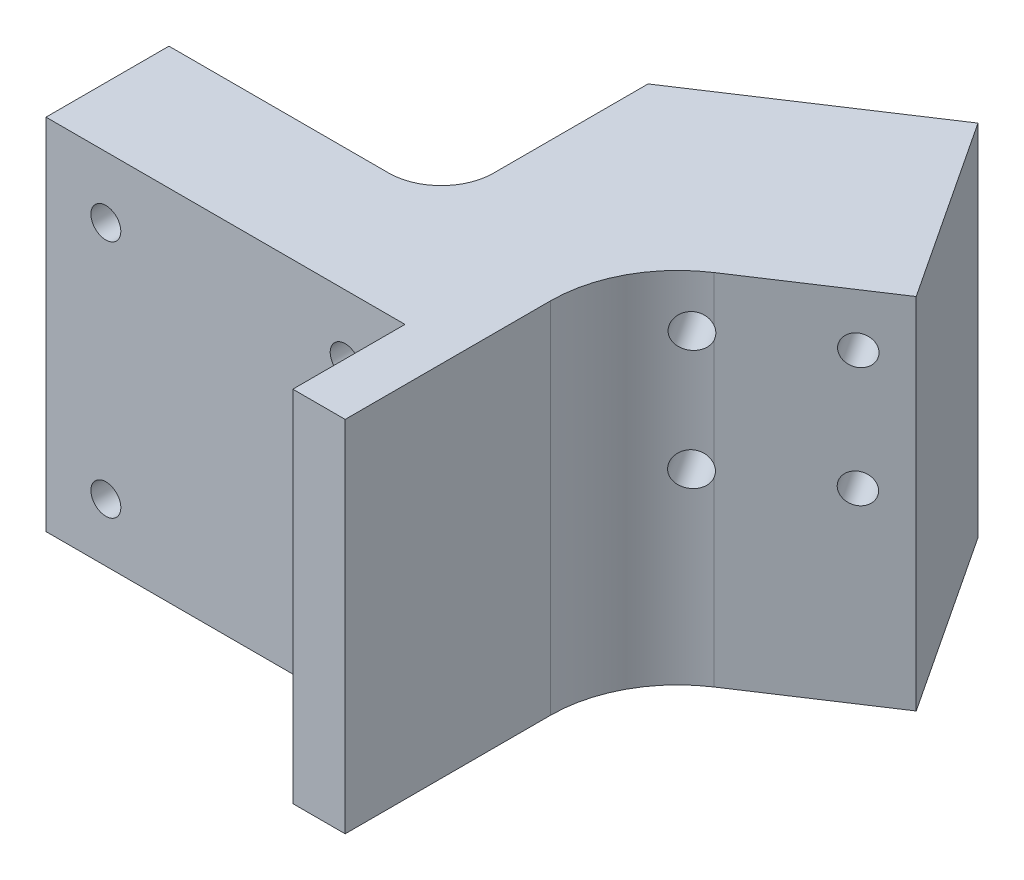
ISO-10303-21;
HEADER;
FILE_DESCRIPTION(('STEP AP214'),'2;1');
FILE_NAME('part.step','',(''),(''),'','','');
FILE_SCHEMA(('AUTOMOTIVE_DESIGN { 1 0 10303 214 1 1 1 1 }'));
ENDSEC;
DATA;
#1=APPLICATION_CONTEXT('core data for automotive mechanical design processes');
#2=APPLICATION_PROTOCOL_DEFINITION('international standard','automotive_design',2000,#1);
#3=PRODUCT_CONTEXT('',#1,'mechanical');
#4=PRODUCT('Part','Part','',(#3));
#5=PRODUCT_RELATED_PRODUCT_CATEGORY('part','',(#4));
#6=PRODUCT_DEFINITION_FORMATION('','',#4);
#7=PRODUCT_DEFINITION_CONTEXT('part definition',#1,'design');
#8=PRODUCT_DEFINITION('design','',#6,#7);
#9=PRODUCT_DEFINITION_SHAPE('','',#8);
#10=(LENGTH_UNIT() NAMED_UNIT(*) SI_UNIT(.MILLI.,.METRE.));
#11=(NAMED_UNIT(*) PLANE_ANGLE_UNIT() SI_UNIT($,.RADIAN.));
#12=(NAMED_UNIT(*) SI_UNIT($,.STERADIAN.) SOLID_ANGLE_UNIT());
#13=UNCERTAINTY_MEASURE_WITH_UNIT(LENGTH_MEASURE(1.E-05),#10,'distance_accuracy_value','');
#14=(GEOMETRIC_REPRESENTATION_CONTEXT(3) GLOBAL_UNCERTAINTY_ASSIGNED_CONTEXT((#13)) GLOBAL_UNIT_ASSIGNED_CONTEXT((#10,
#11,#12)) REPRESENTATION_CONTEXT('',''));
#15=CARTESIAN_POINT('',(0.,0.,0.));
#16=DIRECTION('',(0.,0.,1.));
#17=DIRECTION('',(1.,0.,0.));
#18=AXIS2_PLACEMENT_3D('',#15,#16,#17);
#19=CARTESIAN_POINT('',(0.,0.,30.));
#20=DIRECTION('',(0.,0.,-1.));
#21=DIRECTION('',(-1.,0.,0.));
#22=AXIS2_PLACEMENT_3D('',#19,#20,#21);
#23=PLANE('',#22);
#24=CARTESIAN_POINT('',(25.0060000000012,7.77618582541706,30.));
#25=DIRECTION('',(0.,0.,1.));
#26=DIRECTION('',(1.,0.,0.));
#27=AXIS2_PLACEMENT_3D('',#24,#25,#26);
#28=CIRCLE('',#27,2.00000000000001);
#29=CARTESIAN_POINT('',(27.0060000000012,7.77618582541706,30.));
#30=VERTEX_POINT('',#29);
#31=EDGE_CURVE('E314',#30,#30,#28,.T.);
#32=ORIENTED_EDGE('',*,*,#31,.F.);
#33=EDGE_LOOP('',(#32));
#34=FACE_BOUND('',#33,.T.);
#35=CARTESIAN_POINT('',(25.0060000000012,39.7761858254171,30.));
#36=DIRECTION('',(0.,0.,1.));
#37=DIRECTION('',(1.,0.,0.));
#38=AXIS2_PLACEMENT_3D('',#35,#36,#37);
#39=CIRCLE('',#38,2.00000000000001);
#40=CARTESIAN_POINT('',(27.0060000000012,39.7761858254171,30.));
#41=VERTEX_POINT('',#40);
#42=EDGE_CURVE('E318',#41,#41,#39,.T.);
#43=ORIENTED_EDGE('',*,*,#42,.F.);
#44=EDGE_LOOP('',(#43));
#45=FACE_BOUND('',#44,.T.);
#46=CARTESIAN_POINT('',(-6.99399999999881,39.7761858254171,30.));
#47=DIRECTION('',(0.,0.,1.));
#48=DIRECTION('',(1.,0.,0.));
#49=AXIS2_PLACEMENT_3D('',#46,#47,#48);
#50=CIRCLE('',#49,2.);
#51=CARTESIAN_POINT('',(-4.99399999999881,39.7761858254171,30.));
#52=VERTEX_POINT('',#51);
#53=EDGE_CURVE('E322',#52,#52,#50,.T.);
#54=ORIENTED_EDGE('',*,*,#53,.F.);
#55=EDGE_LOOP('',(#54));
#56=FACE_BOUND('',#55,.T.);
#57=CARTESIAN_POINT('',(-6.99399999999881,7.77618582541706,30.));
#58=DIRECTION('',(0.,0.,1.));
#59=DIRECTION('',(1.,0.,0.));
#60=AXIS2_PLACEMENT_3D('',#57,#58,#59);
#61=CIRCLE('',#60,2.);
#62=CARTESIAN_POINT('',(-4.99399999999881,7.77618582541706,30.));
#63=VERTEX_POINT('',#62);
#64=EDGE_CURVE('E326',#63,#63,#61,.T.);
#65=ORIENTED_EDGE('',*,*,#64,.F.);
#66=EDGE_LOOP('',(#65));
#67=FACE_BOUND('',#66,.T.);
#68=DIRECTION('',(0.,-1.,0.));
#69=VECTOR('',#68,1.);
#70=CARTESIAN_POINT('',(33.006,0.,30.));
#71=LINE('',#70,#69);
#72=CARTESIAN_POINT('',(33.006,48.,30.));
#73=VERTEX_POINT('',#72);
#74=CARTESIAN_POINT('',(33.006,0.,30.));
#75=VERTEX_POINT('',#74);
#76=EDGE_CURVE('E148',#73,#75,#71,.T.);
#77=ORIENTED_EDGE('',*,*,#76,.F.);
#78=DIRECTION('',(-1.,0.,0.));
#79=VECTOR('',#78,1.);
#80=CARTESIAN_POINT('',(0.,48.,30.));
#81=LINE('',#80,#79);
#82=CARTESIAN_POINT('',(-15.,48.,30.));
#83=VERTEX_POINT('',#82);
#84=EDGE_CURVE('E220',#73,#83,#81,.T.);
#85=ORIENTED_EDGE('',*,*,#84,.T.);
#86=DIRECTION('',(0.,1.,0.));
#87=VECTOR('',#86,1.);
#88=CARTESIAN_POINT('',(-15.,0.,30.));
#89=LINE('',#88,#87);
#90=CARTESIAN_POINT('',(-15.,0.,30.));
#91=VERTEX_POINT('',#90);
#92=EDGE_CURVE('E172',#91,#83,#89,.T.);
#93=ORIENTED_EDGE('',*,*,#92,.F.);
#94=DIRECTION('',(1.,0.,0.));
#95=VECTOR('',#94,1.);
#96=CARTESIAN_POINT('',(0.,0.,30.));
#97=LINE('',#96,#95);
#98=EDGE_CURVE('E217',#91,#75,#97,.T.);
#99=ORIENTED_EDGE('',*,*,#98,.T.);
#100=EDGE_LOOP('',(#77,#85,#93,#99));
#101=FACE_BOUND('',#100,.T.);
#102=ADVANCED_FACE('F34',(#34,#45,#56,#67,#101),#23,.F.);
#103=CARTESIAN_POINT('',(0.,48.,0.));
#104=DIRECTION('',(0.550130991546431,0.,0.835078374848817));
#105=DIRECTION('',(0.835078374848817,0.,-0.550130991546431));
#106=AXIS2_PLACEMENT_3D('',#103,#104,#105);
#107=PLANE('',#106);
#108=CARTESIAN_POINT('',(36.6241480711431,32.9790510727815,-24.1271711730877));
#109=DIRECTION('',(-0.550130991546431,0.,-0.835078374848817));
#110=DIRECTION('',(-0.835078374848817,0.,0.550130991546431));
#111=AXIS2_PLACEMENT_3D('',#108,#109,#110);
#112=CIRCLE('',#111,4.1);
#113=CARTESIAN_POINT('',(33.200326734263,32.9790510727815,-21.8716341077473));
#114=VERTEX_POINT('',#113);
#115=EDGE_CURVE('E189',#114,#114,#112,.T.);
#116=ORIENTED_EDGE('',*,*,#115,.F.);
#117=EDGE_LOOP('',(#116));
#118=FACE_BOUND('',#117,.T.);
#119=CARTESIAN_POINT('',(29.9755426002469,41.0209489272188,-19.747218308463));
#120=DIRECTION('',(-0.550130991546431,0.,-0.835078374848817));
#121=DIRECTION('',(-0.835078374848817,0.,0.550130991546431));
#122=AXIS2_PLACEMENT_3D('',#119,#120,#121);
#123=CIRCLE('',#122,2.25);
#124=CARTESIAN_POINT('',(28.096616256837,41.0209489272188,-18.5094235774835));
#125=VERTEX_POINT('',#124);
#126=EDGE_CURVE('E223',#125,#125,#123,.T.);
#127=ORIENTED_EDGE('',*,*,#126,.F.);
#128=EDGE_LOOP('',(#127));
#129=FACE_BOUND('',#128,.T.);
#130=CARTESIAN_POINT('',(29.9420378402032,25.0191727680053,-19.725146120487));
#131=DIRECTION('',(-0.550130991546431,0.,-0.835078374848817));
#132=DIRECTION('',(-0.835078374848817,0.,0.550130991546431));
#133=AXIS2_PLACEMENT_3D('',#130,#131,#132);
#134=CIRCLE('',#133,2.25);
#135=CARTESIAN_POINT('',(28.0631114967933,25.0191727680053,-18.4873513895075));
#136=VERTEX_POINT('',#135);
#137=EDGE_CURVE('E222',#136,#136,#134,.T.);
#138=ORIENTED_EDGE('',*,*,#137,.F.);
#139=EDGE_LOOP('',(#138));
#140=FACE_BOUND('',#139,.T.);
#141=DIRECTION('',(-0.835078374848817,0.,0.550130991546431));
#142=VECTOR('',#141,1.);
#143=CARTESIAN_POINT('',(0.,0.,0.));
#144=LINE('',#143,#142);
#145=CARTESIAN_POINT('',(48.006,0.,-31.6252811419757));
#146=VERTEX_POINT('',#145);
#147=CARTESIAN_POINT('',(21.4077903056441,0.,-14.1029743582981));
#148=VERTEX_POINT('',#147);
#149=EDGE_CURVE('E226',#146,#148,#144,.T.);
#150=ORIENTED_EDGE('',*,*,#149,.T.);
#151=DIRECTION('',(0.,1.,0.));
#152=VECTOR('',#151,1.);
#153=CARTESIAN_POINT('',(21.4077903056441,-2.,-14.1029743582981));
#154=LINE('',#153,#152);
#155=CARTESIAN_POINT('',(21.4077903056441,48.,-14.1029743582981));
#156=VERTEX_POINT('',#155);
#157=EDGE_CURVE('E183',#148,#156,#154,.T.);
#158=ORIENTED_EDGE('',*,*,#157,.T.);
#159=DIRECTION('',(-0.835078374848817,0.,0.550130991546431));
#160=VECTOR('',#159,1.);
#161=CARTESIAN_POINT('',(0.,48.,0.));
#162=LINE('',#161,#160);
#163=CARTESIAN_POINT('',(48.006,48.,-31.6252811419756));
#164=VERTEX_POINT('',#163);
#165=EDGE_CURVE('E229',#164,#156,#162,.T.);
#166=ORIENTED_EDGE('',*,*,#165,.F.);
#167=DIRECTION('',(0.,-1.,0.));
#168=VECTOR('',#167,1.);
#169=CARTESIAN_POINT('',(48.006,48.,-31.6252811419757));
#170=LINE('',#169,#168);
#171=EDGE_CURVE('E232',#164,#146,#170,.T.);
#172=ORIENTED_EDGE('',*,*,#171,.T.);
#173=EDGE_LOOP('',(#150,#158,#166,#172));
#174=FACE_BOUND('',#173,.T.);
#175=CARTESIAN_POINT('',(43.3382798299774,40.9808272319949,-28.5502912934351));
#176=DIRECTION('',(-0.550130991546431,0.,-0.835078374848817));
#177=DIRECTION('',(-0.835078374848817,0.,0.550130991546431));
#178=AXIS2_PLACEMENT_3D('',#175,#176,#177);
#179=CIRCLE('',#178,2.);
#180=CARTESIAN_POINT('',(41.6681230802797,40.9808272319949,-27.4500293103423));
#181=VERTEX_POINT('',#180);
#182=EDGE_CURVE('E193',#181,#181,#179,.T.);
#183=ORIENTED_EDGE('',*,*,#182,.F.);
#184=EDGE_LOOP('',(#183));
#185=FACE_BOUND('',#184,.T.);
#186=CARTESIAN_POINT('',(43.3047750699337,24.9790510727815,-28.5282191054591));
#187=DIRECTION('',(-0.550130991546431,0.,-0.835078374848817));
#188=DIRECTION('',(-0.835078374848817,0.,0.550130991546431));
#189=AXIS2_PLACEMENT_3D('',#186,#187,#188);
#190=CIRCLE('',#189,2.00000000000001);
#191=CARTESIAN_POINT('',(41.634618320236,24.9790510727815,-27.4279571223663));
#192=VERTEX_POINT('',#191);
#193=EDGE_CURVE('E199',#192,#192,#190,.T.);
#194=ORIENTED_EDGE('',*,*,#193,.F.);
#195=EDGE_LOOP('',(#194));
#196=FACE_BOUND('',#195,.T.);
#197=ADVANCED_FACE('F285',(#118,#129,#140,#174,#185,#196),#107,.F.);
#198=CARTESIAN_POINT('',(0.,48.,0.));
#199=DIRECTION('',(0.,1.,0.));
#200=DIRECTION('',(0.,0.,1.));
#201=AXIS2_PLACEMENT_3D('',#198,#199,#200);
#202=PLANE('',#201);
#203=DIRECTION('',(0.,0.,1.));
#204=VECTOR('',#203,1.);
#205=CARTESIAN_POINT('',(40.006,48.,3.10199820500802));
#206=LINE('',#205,#204);
#207=CARTESIAN_POINT('',(40.006,48.,17.5303697674538));
#208=VERTEX_POINT('',#207);
#209=CARTESIAN_POINT('',(40.006,48.,45.));
#210=VERTEX_POINT('',#209);
#211=EDGE_CURVE('E139',#208,#210,#206,.T.);
#212=ORIENTED_EDGE('',*,*,#211,.F.);
#213=CARTESIAN_POINT('',(57.006,48.,17.5303697674538));
#214=DIRECTION('',(0.,1.,0.));
#215=DIRECTION('',(0.,0.,1.));
#216=AXIS2_PLACEMENT_3D('',#213,#214,#215);
#217=CIRCLE('',#216,17.);
#218=CARTESIAN_POINT('',(47.6537731437107,48.,3.33403739502395));
#219=VERTEX_POINT('',#218);
#220=EDGE_CURVE('E11',#208,#219,#217,.F.);
#221=ORIENTED_EDGE('',*,*,#220,.T.);
#222=DIRECTION('',(0.835078374848817,0.,-0.550130991546431));
#223=VECTOR('',#222,1.);
#224=CARTESIAN_POINT('',(63.9597987548465,48.,-7.40800827135996));
#225=LINE('',#224,#223);
#226=CARTESIAN_POINT('',(63.9597987548465,48.,-7.40800827135996));
#227=VERTEX_POINT('',#226);
#228=EDGE_CURVE('E212',#219,#227,#225,.T.);
#229=ORIENTED_EDGE('',*,*,#228,.T.);
#230=DIRECTION('',(-0.550130991546431,0.,-0.835078374848817));
#231=VECTOR('',#230,1.);
#232=CARTESIAN_POINT('',(63.9597987548465,48.,-7.40800827135996));
#233=LINE('',#232,#231);
#234=EDGE_CURVE('E215',#227,#164,#233,.T.);
#235=ORIENTED_EDGE('',*,*,#234,.T.);
#236=ORIENTED_EDGE('',*,*,#165,.T.);
#237=DIRECTION('',(0.,0.,-1.));
#238=VECTOR('',#237,1.);
#239=CARTESIAN_POINT('',(21.4077903056441,48.,-14.1029743582981));
#240=LINE('',#239,#238);
#241=CARTESIAN_POINT('',(21.4077903056441,48.,6.55755744354441));
#242=VERTEX_POINT('',#241);
#243=EDGE_CURVE('E181',#242,#156,#240,.T.);
#244=ORIENTED_EDGE('',*,*,#243,.F.);
#245=CARTESIAN_POINT('',(14.4077903056441,48.,6.55755744354441));
#246=DIRECTION('',(0.,1.,0.));
#247=DIRECTION('',(0.,0.,1.));
#248=AXIS2_PLACEMENT_3D('',#245,#246,#247);
#249=CIRCLE('',#248,7.);
#250=CARTESIAN_POINT('',(14.4077903056441,48.,13.5575574435444));
#251=VERTEX_POINT('',#250);
#252=EDGE_CURVE('E244',#242,#251,#249,.F.);
#253=ORIENTED_EDGE('',*,*,#252,.T.);
#254=DIRECTION('',(1.,0.,0.));
#255=VECTOR('',#254,1.);
#256=CARTESIAN_POINT('',(21.4077903056441,48.,13.5575574435444));
#257=LINE('',#256,#255);
#258=CARTESIAN_POINT('',(-15.,48.,13.5575574435444));
#259=VERTEX_POINT('',#258);
#260=EDGE_CURVE('E178',#259,#251,#257,.T.);
#261=ORIENTED_EDGE('',*,*,#260,.F.);
#262=DIRECTION('',(0.,0.,-1.));
#263=VECTOR('',#262,1.);
#264=CARTESIAN_POINT('',(-15.,48.,13.5575574435444));
#265=LINE('',#264,#263);
#266=EDGE_CURVE('E175',#83,#259,#265,.T.);
#267=ORIENTED_EDGE('',*,*,#266,.F.);
#268=ORIENTED_EDGE('',*,*,#84,.F.);
#269=DIRECTION('',(0.,0.,-1.));
#270=VECTOR('',#269,1.);
#271=CARTESIAN_POINT('',(33.006,48.,45.));
#272=LINE('',#271,#270);
#273=CARTESIAN_POINT('',(33.006,48.,45.));
#274=VERTEX_POINT('',#273);
#275=EDGE_CURVE('E156',#274,#73,#272,.T.);
#276=ORIENTED_EDGE('',*,*,#275,.F.);
#277=DIRECTION('',(-1.,0.,0.));
#278=VECTOR('',#277,1.);
#279=CARTESIAN_POINT('',(48.006,48.,45.));
#280=LINE('',#279,#278);
#281=EDGE_CURVE('E158',#210,#274,#280,.T.);
#282=ORIENTED_EDGE('',*,*,#281,.F.);
#283=EDGE_LOOP('',(#212,#221,#229,#235,#236,#244,#253,#261,#267,#268,#276,#282));
#284=FACE_BOUND('',#283,.T.);
#285=ADVANCED_FACE('F282',(#284),#202,.T.);
#286=CARTESIAN_POINT('',(0.,0.,0.));
#287=DIRECTION('',(0.,1.,0.));
#288=DIRECTION('',(0.,0.,1.));
#289=AXIS2_PLACEMENT_3D('',#286,#287,#288);
#290=PLANE('',#289);
#291=DIRECTION('',(-0.835078374848817,0.,0.550130991546431));
#292=VECTOR('',#291,1.);
#293=CARTESIAN_POINT('',(63.9597987548465,0.,-7.40800827135996));
#294=LINE('',#293,#292);
#295=CARTESIAN_POINT('',(63.9597987548465,0.,-7.40800827135996));
#296=VERTEX_POINT('',#295);
#297=CARTESIAN_POINT('',(47.6537731437107,0.,3.33403739502395));
#298=VERTEX_POINT('',#297);
#299=EDGE_CURVE('E210',#296,#298,#294,.T.);
#300=ORIENTED_EDGE('',*,*,#299,.T.);
#301=CARTESIAN_POINT('',(57.006,0.,17.5303697674538));
#302=DIRECTION('',(0.,1.,0.));
#303=DIRECTION('',(0.,0.,1.));
#304=AXIS2_PLACEMENT_3D('',#301,#302,#303);
#305=CIRCLE('',#304,17.);
#306=CARTESIAN_POINT('',(40.006,0.,17.5303697674538));
#307=VERTEX_POINT('',#306);
#308=EDGE_CURVE('E44',#298,#307,#305,.T.);
#309=ORIENTED_EDGE('',*,*,#308,.T.);
#310=DIRECTION('',(0.,0.,-1.));
#311=VECTOR('',#310,1.);
#312=CARTESIAN_POINT('',(40.006,0.,3.10199820500802));
#313=LINE('',#312,#311);
#314=CARTESIAN_POINT('',(40.006,0.,45.));
#315=VERTEX_POINT('',#314);
#316=EDGE_CURVE('E138',#315,#307,#313,.T.);
#317=ORIENTED_EDGE('',*,*,#316,.F.);
#318=DIRECTION('',(1.,0.,0.));
#319=VECTOR('',#318,1.);
#320=CARTESIAN_POINT('',(48.006,0.,45.));
#321=LINE('',#320,#319);
#322=CARTESIAN_POINT('',(33.006,0.,45.));
#323=VERTEX_POINT('',#322);
#324=EDGE_CURVE('E147',#323,#315,#321,.T.);
#325=ORIENTED_EDGE('',*,*,#324,.F.);
#326=DIRECTION('',(0.,0.,-1.));
#327=VECTOR('',#326,1.);
#328=CARTESIAN_POINT('',(33.006,0.,45.));
#329=LINE('',#328,#327);
#330=EDGE_CURVE('E154',#323,#75,#329,.T.);
#331=ORIENTED_EDGE('',*,*,#330,.T.);
#332=ORIENTED_EDGE('',*,*,#98,.F.);
#333=DIRECTION('',(0.,0.,1.));
#334=VECTOR('',#333,1.);
#335=CARTESIAN_POINT('',(-15.,0.,13.5575574435444));
#336=LINE('',#335,#334);
#337=CARTESIAN_POINT('',(-15.,0.,13.5575574435444));
#338=VERTEX_POINT('',#337);
#339=EDGE_CURVE('E169',#338,#91,#336,.T.);
#340=ORIENTED_EDGE('',*,*,#339,.F.);
#341=DIRECTION('',(1.,0.,0.));
#342=VECTOR('',#341,1.);
#343=CARTESIAN_POINT('',(0.,0.,13.5575574435444));
#344=LINE('',#343,#342);
#345=CARTESIAN_POINT('',(14.4077903056441,0.,13.5575574435444));
#346=VERTEX_POINT('',#345);
#347=EDGE_CURVE('E186',#338,#346,#344,.T.);
#348=ORIENTED_EDGE('',*,*,#347,.T.);
#349=CARTESIAN_POINT('',(14.4077903056441,0.,6.55755744354441));
#350=DIRECTION('',(0.,1.,0.));
#351=DIRECTION('',(0.,0.,1.));
#352=AXIS2_PLACEMENT_3D('',#349,#350,#351);
#353=CIRCLE('',#352,7.);
#354=CARTESIAN_POINT('',(21.4077903056441,0.,6.55755744354441));
#355=VERTEX_POINT('',#354);
#356=EDGE_CURVE('E246',#346,#355,#353,.T.);
#357=ORIENTED_EDGE('',*,*,#356,.T.);
#358=DIRECTION('',(0.,0.,-1.));
#359=VECTOR('',#358,1.);
#360=CARTESIAN_POINT('',(21.4077903056441,0.,0.));
#361=LINE('',#360,#359);
#362=EDGE_CURVE('E237',#355,#148,#361,.T.);
#363=ORIENTED_EDGE('',*,*,#362,.T.);
#364=ORIENTED_EDGE('',*,*,#149,.F.);
#365=DIRECTION('',(-0.550130991546431,0.,-0.835078374848817));
#366=VECTOR('',#365,1.);
#367=CARTESIAN_POINT('',(63.9597987548465,0.,-7.40800827135996));
#368=LINE('',#367,#366);
#369=EDGE_CURVE('E214',#296,#146,#368,.T.);
#370=ORIENTED_EDGE('',*,*,#369,.F.);
#371=EDGE_LOOP('',(#300,#309,#317,#325,#331,#332,#340,#348,#357,#363,#364,#370));
#372=FACE_BOUND('',#371,.T.);
#373=ADVANCED_FACE('F145',(#372),#290,.F.);
#374=CARTESIAN_POINT('',(57.4820921775684,41.0209489272188,22.0067004339778));
#375=DIRECTION('',(-0.550130991546431,0.,-0.835078374848817));
#376=DIRECTION('',(-0.835078374848817,0.,0.550130991546431));
#377=AXIS2_PLACEMENT_3D('',#374,#375,#376);
#378=CYLINDRICAL_SURFACE('',#377,2.25);
#379=ORIENTED_EDGE('',*,*,#126,.T.);
#380=EDGE_LOOP('',(#379));
#381=FACE_BOUND('',#380,.T.);
#382=CARTESIAN_POINT('',(45.9293413550934,41.0209489272188,4.47005456215269));
#383=DIRECTION('',(0.550130991546431,0.,0.835078374848817));
#384=DIRECTION('',(0.835078374848817,0.,-0.550130991546431));
#385=AXIS2_PLACEMENT_3D('',#382,#383,#384);
#386=CIRCLE('',#385,2.25);
#387=CARTESIAN_POINT('',(47.6537731437107,40.1274725691684,3.33403739502395));
#388=VERTEX_POINT('',#387);
#389=CARTESIAN_POINT('',(47.6537731437107,41.9144252852691,3.33403739502395));
#390=VERTEX_POINT('',#389);
#391=EDGE_CURVE('E424',#388,#390,#386,.T.);
#392=ORIENTED_EDGE('',*,*,#391,.T.);
#393=CARTESIAN_POINT('',(47.6537731437107,41.9144252852691,3.33403739502395));
#394=CARTESIAN_POINT('',(47.6328240273058,41.9724057637155,3.34783985776282));
#395=CARTESIAN_POINT('',(47.6098740622435,42.0293016988114,3.36302361222748));
#396=CARTESIAN_POINT('',(47.5601638282943,42.1405778953265,3.39611766619116));
#397=CARTESIAN_POINT('',(47.5334036915473,42.1949582439018,3.41402787113607));
#398=CARTESIAN_POINT('',(47.447776290936,42.3536570714081,3.4717393480809));
#399=CARTESIAN_POINT('',(47.3834996131344,42.4537049753375,3.51556208468387));
#400=CARTESIAN_POINT('',(47.242796675469,42.6393389806029,3.61321562160773));
#401=CARTESIAN_POINT('',(47.166363658483,42.7249169839144,3.66705199086122));
#402=CARTESIAN_POINT('',(47.0039575853083,42.879160533128,3.7837657015689));
#403=CARTESIAN_POINT('',(46.9179871699948,42.9478307438729,3.84664054171858));
#404=CARTESIAN_POINT('',(46.7395899629613,43.0661805928678,3.97997573003902));
#405=CARTESIAN_POINT('',(46.6471805918,43.1159092849482,4.05041587031663));
#406=CARTESIAN_POINT('',(46.458655514781,43.1952993219088,4.19741052075489));
#407=CARTESIAN_POINT('',(46.3625392479337,43.2249576167039,4.27396595827769));
#408=CARTESIAN_POINT('',(46.1695699595232,43.2634781348731,4.43123731683537));
#409=CARTESIAN_POINT('',(46.0727170043538,43.272342210553,4.51195286664142));
#410=CARTESIAN_POINT('',(45.8810509717666,43.2691998202631,4.6753562814653));
#411=CARTESIAN_POINT('',(45.7862378757473,43.2571935446927,4.75804412848315));
#412=CARTESIAN_POINT('',(45.6001709825686,43.2125703032783,4.92391239116844));
#413=CARTESIAN_POINT('',(45.5089659571609,43.1797347894876,5.00708864869902));
#414=CARTESIAN_POINT('',(45.3334538948611,43.0942791958247,5.17051290540198));
#415=CARTESIAN_POINT('',(45.249147779308,43.0416564786341,5.25076051266723));
#416=CARTESIAN_POINT('',(45.0880918396024,42.9170984119821,5.40699304924508));
#417=CARTESIAN_POINT('',(45.0114839133472,42.8448685384135,5.48288962202021));
#418=CARTESIAN_POINT('',(44.869097492692,42.6834307615879,5.6263439759198));
#419=CARTESIAN_POINT('',(44.8033195067642,42.5942220615884,5.69390136547733));
#420=CARTESIAN_POINT('',(44.6838948212743,42.4009281132841,5.81827371451939));
#421=CARTESIAN_POINT('',(44.6302798688677,42.296805065049,5.87506049942497));
#422=CARTESIAN_POINT('',(44.5366404538948,42.0766946613139,5.97529308771256));
#423=CARTESIAN_POINT('',(44.4966141388656,41.9607089257952,6.01874070947077));
#424=CARTESIAN_POINT('',(44.4318312218643,41.7227871884635,6.08954172119449));
#425=CARTESIAN_POINT('',(44.4067649457824,41.6010326328553,6.11722092479604));
#426=CARTESIAN_POINT('',(44.3712097053253,41.3529031591755,6.15659330756753));
#427=CARTESIAN_POINT('',(44.3607178661196,41.2265291573456,6.16828963937656));
#428=CARTESIAN_POINT('',(44.3546637420013,40.9765122162076,6.17503150846956));
#429=CARTESIAN_POINT('',(44.3586946530937,40.8528909816016,6.17053075446009));
#430=CARTESIAN_POINT('',(44.3806822865519,40.6084518143867,6.14609913211359));
#431=CARTESIAN_POINT('',(44.3986384792113,40.4876337753264,6.1261688507033));
#432=CARTESIAN_POINT('',(44.4479228259199,40.2527485747771,6.07192220565243));
#433=CARTESIAN_POINT('',(44.4791880680085,40.1386524911655,6.03767353855906));
#434=CARTESIAN_POINT('',(44.5543695455787,39.9196081580794,5.9562626642666));
#435=CARTESIAN_POINT('',(44.5982872266883,39.8146609557133,5.90909898146874));
#436=CARTESIAN_POINT('',(44.6989896802526,39.6142628447848,5.80249786121089));
#437=CARTESIAN_POINT('',(44.7560475564871,39.5190863874156,5.74280271077443));
#438=CARTESIAN_POINT('',(44.8812241212986,39.3434493799588,5.61408441110484));
#439=CARTESIAN_POINT('',(44.9493445048394,39.2629910889675,5.54505983271723));
#440=CARTESIAN_POINT('',(45.0971871349127,39.1168701200679,5.39812732185712));
#441=CARTESIAN_POINT('',(45.1771711292958,39.0516611396429,5.32003105817981));
#442=CARTESIAN_POINT('',(45.3455022904294,38.9406609410858,5.15918011077218));
#443=CARTESIAN_POINT('',(45.4338498891749,38.8948707266374,5.07642518650342));
#444=CARTESIAN_POINT('',(45.6173663860121,38.8238391735681,4.90838144046892));
#445=CARTESIAN_POINT('',(45.7125754696918,38.7987317732245,4.82307975309102));
#446=CARTESIAN_POINT('',(45.9067584851449,38.7704514605406,4.65312329214548));
#447=CARTESIAN_POINT('',(46.0057321389076,38.7672769316241,4.56846847135956));
#448=CARTESIAN_POINT('',(46.2032327287212,38.7830327710223,4.40342935213789));
#449=CARTESIAN_POINT('',(46.3017480894346,38.8016696127512,4.32300322182241));
#450=CARTESIAN_POINT('',(46.4966047810822,38.8601810694796,4.16743003958659));
#451=CARTESIAN_POINT('',(46.5929464225561,38.900052630583,4.09228223031688));
#452=CARTESIAN_POINT('',(46.7790019864182,38.9992498742583,3.95016215881082));
#453=CARTESIAN_POINT('',(46.8687906870993,39.0582907868618,3.88308881528538));
#454=CARTESIAN_POINT('',(47.0403219415032,39.1943636554442,3.75733125858016));
#455=CARTESIAN_POINT('',(47.1220616758804,39.271401883779,3.69864998169275));
#456=CARTESIAN_POINT('',(47.2745107724955,39.4410326673032,3.59097142817763));
#457=CARTESIAN_POINT('',(47.3452468536521,39.5335863744104,3.54195061431286));
#458=CARTESIAN_POINT('',(47.4734622319515,39.7317052081687,3.45426355601968));
#459=CARTESIAN_POINT('',(47.5309636434238,39.8372481708396,3.41558002094578));
#460=CARTESIAN_POINT('',(47.5940946923487,39.9769961817042,3.37352375671299));
#461=CARTESIAN_POINT('',(47.6068063139253,40.006668816913,3.36508224335048));
#462=CARTESIAN_POINT('',(47.631119391414,40.066617738646,3.34897963112422));
#463=CARTESIAN_POINT('',(47.6427225019302,40.0968930413168,3.34131736798401));
#464=CARTESIAN_POINT('',(47.6537731437107,40.1274725691684,3.33403739502395));
#465=B_SPLINE_CURVE_WITH_KNOTS('',3,(#393,#394,#395,#396,#397,#398,#399,#400,#401,#402,#403,
#404,#405,#406,#407,#408,#409,#410,#411,#412,#413,#414,#415,#416,#417,#418,#419,#420,#421,#422,
#423,#424,#425,#426,#427,#428,#429,#430,#431,#432,#433,#434,#435,#436,#437,#438,#439,#440,#441,
#442,#443,#444,#445,#446,#447,#448,#449,#450,#451,#452,#453,#454,#455,#456,#457,#458,#459,#460,
#461,#462,#463,#464),.UNSPECIFIED.,.F.,.F.,(4,2,2,2,2,2,2,2,2,2,2,2,2,2,2,2,2,2,2,2,2,2,2,2,2,2,
2,2,2,2,2,2,2,2,2,4),(0.,0.189409686097939,0.378812804908408,0.757064868545775,1.1355279238316,
1.51388644424121,1.89125833784457,2.26868756753458,2.64608317533371,3.02347534018599,
3.40489425686774,3.78636402862998,4.17391553864617,4.56148523925411,4.95005519887678,
5.33857216563906,5.71873953193705,6.09883189897349,6.46836111863201,6.83787628238825,
7.20566381000146,7.57349337654346,7.94979635661883,8.32615704718896,8.71259212268112,
9.09904716912772,9.48798558235814,9.87689532833105,10.260630932268,10.6443113637151,
11.0225345549743,11.400889760308,11.7783114043513,12.1550977456833,12.2551763346104,
12.3551031289764),.UNSPECIFIED.);
#466=EDGE_CURVE('E256',#390,#388,#465,.T.);
#467=ORIENTED_EDGE('',*,*,#466,.T.);
#468=EDGE_LOOP('',(#392,#467));
#469=FACE_BOUND('',#468,.T.);
#470=ADVANCED_FACE('F270',(#381,#469),#378,.F.);
#471=CARTESIAN_POINT('',(57.4485874175247,25.0191727680053,22.0287726219539));
#472=DIRECTION('',(-0.550130991546431,0.,-0.835078374848817));
#473=DIRECTION('',(-0.835078374848817,0.,0.550130991546431));
#474=AXIS2_PLACEMENT_3D('',#471,#472,#473);
#475=CYLINDRICAL_SURFACE('',#474,2.25);
#476=ORIENTED_EDGE('',*,*,#137,.T.);
#477=EDGE_LOOP('',(#476));
#478=FACE_BOUND('',#477,.T.);
#479=CARTESIAN_POINT('',(45.8958365950496,25.0191727680053,4.49212675012871));
#480=DIRECTION('',(0.550130991546431,0.,0.835078374848817));
#481=DIRECTION('',(0.835078374848817,0.,-0.550130991546431));
#482=AXIS2_PLACEMENT_3D('',#479,#480,#481);
#483=CIRCLE('',#482,2.25);
#484=CARTESIAN_POINT('',(47.6537731437107,24.2248251511052,3.33403739502395));
#485=VERTEX_POINT('',#484);
#486=CARTESIAN_POINT('',(47.6537731437107,25.8135203849054,3.33403739502395));
#487=VERTEX_POINT('',#486);
#488=EDGE_CURVE('E427',#485,#487,#483,.T.);
#489=ORIENTED_EDGE('',*,*,#488,.T.);
#490=CARTESIAN_POINT('',(47.6537731437107,25.8135203849054,3.33403739502395));
#491=CARTESIAN_POINT('',(47.6351422193949,25.8726469899369,3.34631284533131));
#492=CARTESIAN_POINT('',(47.6144617930164,25.9308051120439,3.35998737636677));
#493=CARTESIAN_POINT('',(47.5691769493041,26.044829344121,3.3901037668729));
#494=CARTESIAN_POINT('',(47.5445726755802,26.10069553788,3.40654552506632));
#495=CARTESIAN_POINT('',(47.4652119115973,26.2641702367749,3.45992469717549));
#496=CARTESIAN_POINT('',(47.4048518386539,26.367830201477,3.50095217433176));
#497=CARTESIAN_POINT('',(47.2713319744302,26.5614398992606,3.59326787091317));
#498=CARTESIAN_POINT('',(47.1981651996376,26.6513821016919,3.6445616907902));
#499=CARTESIAN_POINT('',(47.0415446658279,26.8149802781005,3.75652233564097));
#500=CARTESIAN_POINT('',(46.9580936891692,26.8886406420773,3.81718662658394));
#501=CARTESIAN_POINT('',(46.7839116431246,27.0174411916084,3.94653262541991));
#502=CARTESIAN_POINT('',(46.6931991825323,27.0726269506802,4.01519403278425));
#503=CARTESIAN_POINT('',(46.5072430712777,27.1632327891558,4.15913510255066));
#504=CARTESIAN_POINT('',(46.4119987708226,27.1986500247467,4.2344157153604));
#505=CARTESIAN_POINT('',(46.2200455203515,27.2487925995993,4.38965432597841));
#506=CARTESIAN_POINT('',(46.1233379689045,27.2635365736803,4.46960804364312));
#507=CARTESIAN_POINT('',(45.9312081591316,27.272142429246,4.632121119901));
#508=CARTESIAN_POINT('',(45.8357858783569,27.2660046759328,4.71468043289973));
#509=CARTESIAN_POINT('',(45.6479232373177,27.233035981252,4.88086498763066));
#510=CARTESIAN_POINT('',(45.5555195141104,27.206010310668,4.96449293618865));
#511=CARTESIAN_POINT('',(45.3769780933771,27.1319179767416,5.12953737786068));
#512=CARTESIAN_POINT('',(45.2908412222198,27.0848486759649,5.21095357844226));
#513=CARTESIAN_POINT('',(45.1254937801203,26.9710762990368,5.37031298159331));
#514=CARTESIAN_POINT('',(45.046419844146,26.9040641182868,5.44817740723787));
#515=CARTESIAN_POINT('',(44.8985972102364,26.7525256901655,5.5963107153244));
#516=CARTESIAN_POINT('',(44.8298491898084,26.6679982944452,5.66657909928765));
#517=CARTESIAN_POINT('',(44.7038488128963,26.4831411415068,5.79728073165081));
#518=CARTESIAN_POINT('',(44.6466613879129,26.3827274827475,5.85765808523914));
#519=CARTESIAN_POINT('',(44.5455666341901,26.1691446605983,5.96563496828962));
#520=CARTESIAN_POINT('',(44.5016578089613,26.0559769365577,6.01323593757365));
#521=CARTESIAN_POINT('',(44.4288750762722,25.8223304778257,6.09276535397129));
#522=CARTESIAN_POINT('',(44.3997313271507,25.7020315313468,6.12497442545601));
#523=CARTESIAN_POINT('',(44.3559712452348,25.4557292260565,6.17352795456454));
#524=CARTESIAN_POINT('',(44.3413518591305,25.3297270719984,6.18987574652769));
#525=CARTESIAN_POINT('',(44.3272271951263,25.0795715571879,6.20566987881274));
#526=CARTESIAN_POINT('',(44.3272903469391,24.9554726953876,6.20559882584245));
#527=CARTESIAN_POINT('',(44.3414512976068,24.7090985160823,6.18976500116624));
#528=CARTESIAN_POINT('',(44.3555481803406,24.5868230800729,6.17400325374809));
#529=CARTESIAN_POINT('',(44.3972317517637,24.3486873569704,6.12774241307597));
#530=CARTESIAN_POINT('',(44.4246936139747,24.2327785433126,6.09737972061962));
#531=CARTESIAN_POINT('',(44.4924136642019,24.0092714801743,6.02329967278222));
#532=CARTESIAN_POINT('',(44.5326731255307,23.9016740589706,5.97958098854751));
#533=CARTESIAN_POINT('',(44.6260692232231,23.6954209554982,5.87952960801938));
#534=CARTESIAN_POINT('',(44.679453095746,23.5969940026337,5.82295653039199));
#535=CARTESIAN_POINT('',(44.797512545659,23.4140977115924,5.69989675652275));
#536=CARTESIAN_POINT('',(44.8621899186099,23.3296305970622,5.63340848410344));
#537=CARTESIAN_POINT('',(45.0035036772369,23.1745468782423,5.49083393935293));
#538=CARTESIAN_POINT('',(45.0804294185764,23.1043960128571,5.41452738663475));
#539=CARTESIAN_POINT('',(45.2431187666845,22.9829398768226,5.25651656547939));
#540=CARTESIAN_POINT('',(45.3288830573291,22.9316360658535,5.17481187954159));
#541=CARTESIAN_POINT('',(45.5081648562362,22.8489174506426,5.0077927361298));
#542=CARTESIAN_POINT('',(45.6017533545549,22.8177137535214,4.92244969190885));
#543=CARTESIAN_POINT('',(45.793458643928,22.7770899126306,4.75166146315262));
#544=CARTESIAN_POINT('',(45.8915750991702,22.7676681560609,4.66621628664829));
#545=CARTESIAN_POINT('',(46.0883976023372,22.7710485504371,4.4987750391861));
#546=CARTESIAN_POINT('',(46.1870837925057,22.7835955883531,4.41675055087631));
#547=CARTESIAN_POINT('',(46.3831625963242,22.8302322660904,4.25741660186862));
#548=CARTESIAN_POINT('',(46.4805553283938,22.8643199197343,4.18010670717676));
#549=CARTESIAN_POINT('',(46.6694405144441,22.952466857032,4.0333464574363));
#550=CARTESIAN_POINT('',(46.7610008576201,23.0062096037014,3.9637931685945));
#551=CARTESIAN_POINT('',(46.9368592269905,23.1322570450727,3.83276254391403));
#552=CARTESIAN_POINT('',(47.0211565974162,23.2045634135304,3.77128593705098));
#553=CARTESIAN_POINT('',(47.1792699909347,23.3652890661215,3.65792162873959));
#554=CARTESIAN_POINT('',(47.2531332533855,23.4536313010163,3.60599036704085));
#555=CARTESIAN_POINT('',(47.3883206077789,23.6441490711015,3.51227357498329));
#556=CARTESIAN_POINT('',(47.449654339842,23.7463138699464,3.47048023990902));
#557=CARTESIAN_POINT('',(47.5332600643013,23.912820546924,3.41412112454801));
#558=CARTESIAN_POINT('',(47.5606617162063,23.9734006274105,3.3957841494502));
#559=CARTESIAN_POINT('',(47.6107724401909,24.0972167458839,3.36242760268502));
#560=CARTESIAN_POINT('',(47.633489814925,24.1604478413957,3.34740215817683));
#561=CARTESIAN_POINT('',(47.6537731437107,24.2248251511052,3.33403739502395));
#562=B_SPLINE_CURVE_WITH_KNOTS('',3,(#490,#491,#492,#493,#494,#495,#496,#497,#498,#499,#500,
#501,#502,#503,#504,#505,#506,#507,#508,#509,#510,#511,#512,#513,#514,#515,#516,#517,#518,#519,
#520,#521,#522,#523,#524,#525,#526,#527,#528,#529,#530,#531,#532,#533,#534,#535,#536,#537,#538,
#539,#540,#541,#542,#543,#544,#545,#546,#547,#548,#549,#550,#551,#552,#553,#554,#555,#556,#557,
#558,#559,#560,#561),.UNSPECIFIED.,.F.,.F.,(4,2,2,2,2,2,2,2,2,2,2,2,2,2,2,2,2,2,2,2,2,2,2,2,2,2,
2,2,2,2,2,2,2,2,2,4),(0.,0.189472339829895,0.378937746703147,0.757313266024643,1.13589576052093,
1.51437605465457,1.89191570551592,2.26950965358282,2.64676302024967,3.02400978914171,
3.40481652965559,3.78567339399153,4.17277147804389,4.55989494941866,4.94913577176188,
5.33833271056445,5.72013405410672,6.1018551184229,6.47235754887214,6.84283579452631,
7.20991838318817,7.57703750661349,7.95168823324938,8.32639858017229,8.71183614348344,
9.09730355215285,9.48675613472885,9.87617988014577,10.2611113770423,10.6460073860634,
11.0249597084417,11.4039462103883,11.781157766399,12.1580779966263,12.36473345234,
12.5710194115449),.UNSPECIFIED.);
#563=EDGE_CURVE('E263',#487,#485,#562,.T.);
#564=ORIENTED_EDGE('',*,*,#563,.T.);
#565=EDGE_LOOP('',(#489,#564));
#566=FACE_BOUND('',#565,.T.);
#567=ADVANCED_FACE('F274',(#478,#566),#475,.F.);
#568=CARTESIAN_POINT('',(15.9537987548465,0.,24.2172728706157));
#569=DIRECTION('',(0.550130991546431,0.,0.835078374848817));
#570=DIRECTION('',(0.835078374848817,0.,-0.550130991546431));
#571=AXIS2_PLACEMENT_3D('',#568,#569,#570);
#572=PLANE('',#571);
#573=ORIENTED_EDGE('',*,*,#228,.F.);
#574=DIRECTION('',(0.,-1.,0.));
#575=VECTOR('',#574,1.);
#576=CARTESIAN_POINT('',(47.6537731437107,0.,3.33403739502395));
#577=LINE('',#576,#575);
#578=EDGE_CURVE('E252',#219,#390,#577,.T.);
#579=ORIENTED_EDGE('',*,*,#578,.T.);
#580=ORIENTED_EDGE('',*,*,#391,.F.);
#581=DIRECTION('',(0.,-1.,0.));
#582=VECTOR('',#581,1.);
#583=CARTESIAN_POINT('',(47.6537731437107,0.,3.33403739502395));
#584=LINE('',#583,#582);
#585=EDGE_CURVE('E250',#388,#487,#584,.T.);
#586=ORIENTED_EDGE('',*,*,#585,.T.);
#587=ORIENTED_EDGE('',*,*,#488,.F.);
#588=DIRECTION('',(0.,-1.,0.));
#589=VECTOR('',#588,1.);
#590=CARTESIAN_POINT('',(47.6537731437107,0.,3.33403739502395));
#591=LINE('',#590,#589);
#592=EDGE_CURVE('E248',#485,#298,#591,.T.);
#593=ORIENTED_EDGE('',*,*,#592,.T.);
#594=ORIENTED_EDGE('',*,*,#299,.F.);
#595=DIRECTION('',(0.,-1.,0.));
#596=VECTOR('',#595,1.);
#597=CARTESIAN_POINT('',(63.9597987548465,0.,-7.40800827135996));
#598=LINE('',#597,#596);
#599=EDGE_CURVE('E205',#227,#296,#598,.T.);
#600=ORIENTED_EDGE('',*,*,#599,.F.);
#601=EDGE_LOOP('',(#573,#579,#580,#586,#587,#593,#594,#600));
#602=FACE_BOUND('',#601,.T.);
#603=CARTESIAN_POINT('',(59.2585738247802,24.9790510727815,-4.31094623484344));
#604=DIRECTION('',(-0.550130991546431,0.,-0.835078374848817));
#605=DIRECTION('',(-0.835078374848817,0.,0.550130991546431));
#606=AXIS2_PLACEMENT_3D('',#603,#604,#605);
#607=CIRCLE('',#606,2.00000000000001);
#608=CARTESIAN_POINT('',(57.5884170750825,24.9790510727815,-3.21068425175057));
#609=VERTEX_POINT('',#608);
#610=EDGE_CURVE('E202',#609,#609,#607,.T.);
#611=ORIENTED_EDGE('',*,*,#610,.T.);
#612=EDGE_LOOP('',(#611));
#613=FACE_BOUND('',#612,.T.);
#614=CARTESIAN_POINT('',(59.2920785848239,40.9808272319949,-4.33301842281946));
#615=DIRECTION('',(-0.550130991546431,0.,-0.835078374848817));
#616=DIRECTION('',(-0.835078374848817,0.,0.550130991546431));
#617=AXIS2_PLACEMENT_3D('',#614,#615,#616);
#618=CIRCLE('',#617,2.);
#619=CARTESIAN_POINT('',(57.6219218351262,40.9808272319949,-3.2327564397266));
#620=VERTEX_POINT('',#619);
#621=EDGE_CURVE('E196',#620,#620,#618,.T.);
#622=ORIENTED_EDGE('',*,*,#621,.T.);
#623=EDGE_LOOP('',(#622));
#624=FACE_BOUND('',#623,.T.);
#625=ADVANCED_FACE('F280',(#602,#613,#624),#572,.T.);
#626=CARTESIAN_POINT('',(63.9597987548465,0.,-7.40800827135996));
#627=DIRECTION('',(0.835078374848817,0.,-0.550130991546431));
#628=DIRECTION('',(-0.550130991546431,0.,-0.835078374848817));
#629=AXIS2_PLACEMENT_3D('',#626,#627,#628);
#630=PLANE('',#629);
#631=ORIENTED_EDGE('',*,*,#171,.F.);
#632=ORIENTED_EDGE('',*,*,#234,.F.);
#633=ORIENTED_EDGE('',*,*,#599,.T.);
#634=ORIENTED_EDGE('',*,*,#369,.T.);
#635=EDGE_LOOP('',(#631,#632,#633,#634));
#636=FACE_BOUND('',#635,.T.);
#637=ADVANCED_FACE('F355',(#636),#630,.T.);
#638=CARTESIAN_POINT('',(59.2585738247802,24.9790510727815,-4.31094623484344));
#639=DIRECTION('',(-0.550130991546431,0.,-0.835078374848817));
#640=DIRECTION('',(-0.835078374848817,0.,0.550130991546431));
#641=AXIS2_PLACEMENT_3D('',#638,#639,#640);
#642=CYLINDRICAL_SURFACE('',#641,2.00000000000001);
#643=ORIENTED_EDGE('',*,*,#610,.F.);
#644=EDGE_LOOP('',(#643));
#645=FACE_BOUND('',#644,.T.);
#646=ORIENTED_EDGE('',*,*,#193,.T.);
#647=EDGE_LOOP('',(#646));
#648=FACE_BOUND('',#647,.T.);
#649=ADVANCED_FACE('F357',(#645,#648),#642,.F.);
#650=CARTESIAN_POINT('',(59.2920785848239,40.9808272319949,-4.33301842281946));
#651=DIRECTION('',(-0.550130991546431,0.,-0.835078374848817));
#652=DIRECTION('',(-0.835078374848817,0.,0.550130991546431));
#653=AXIS2_PLACEMENT_3D('',#650,#651,#652);
#654=CYLINDRICAL_SURFACE('',#653,2.);
#655=ORIENTED_EDGE('',*,*,#621,.F.);
#656=EDGE_LOOP('',(#655));
#657=FACE_BOUND('',#656,.T.);
#658=ORIENTED_EDGE('',*,*,#182,.T.);
#659=EDGE_LOOP('',(#658));
#660=FACE_BOUND('',#659,.T.);
#661=ADVANCED_FACE('F362',(#657,#660),#654,.F.);
#662=CARTESIAN_POINT('',(40.4750650119682,32.9790510727815,-18.281622549146));
#663=DIRECTION('',(-0.550130991546431,0.,-0.835078374848817));
#664=DIRECTION('',(-0.835078374848817,0.,0.550130991546431));
#665=AXIS2_PLACEMENT_3D('',#662,#663,#664);
#666=CYLINDRICAL_SURFACE('',#665,4.1);
#667=CARTESIAN_POINT('',(40.4750650119682,32.9790510727815,-18.281622549146));
#668=DIRECTION('',(-0.550130991546431,0.,-0.835078374848817));
#669=DIRECTION('',(-0.835078374848817,0.,0.550130991546431));
#670=AXIS2_PLACEMENT_3D('',#667,#668,#669);
#671=CIRCLE('',#670,4.1);
#672=CARTESIAN_POINT('',(37.051243675088,32.9790510727815,-16.0260854838056));
#673=VERTEX_POINT('',#672);
#674=EDGE_CURVE('E190',#673,#673,#671,.T.);
#675=ORIENTED_EDGE('',*,*,#674,.F.);
#676=EDGE_LOOP('',(#675));
#677=FACE_BOUND('',#676,.T.);
#678=ORIENTED_EDGE('',*,*,#115,.T.);
#679=EDGE_LOOP('',(#678));
#680=FACE_BOUND('',#679,.T.);
#681=ADVANCED_FACE('F369',(#677,#680),#666,.F.);
#682=CARTESIAN_POINT('',(40.4750650119682,32.9790510727815,-18.281622549146));
#683=DIRECTION('',(-0.550130991546431,0.,-0.835078374848817));
#684=DIRECTION('',(-0.835078374848817,0.,0.550130991546431));
#685=AXIS2_PLACEMENT_3D('',#682,#683,#684);
#686=PLANE('',#685);
#687=ORIENTED_EDGE('',*,*,#674,.T.);
#688=EDGE_LOOP('',(#687));
#689=FACE_BOUND('',#688,.T.);
#690=ADVANCED_FACE('F373',(#689),#686,.T.);
#691=CARTESIAN_POINT('',(21.4077903056441,-2.,-14.1029743582981));
#692=DIRECTION('',(1.,0.,0.));
#693=DIRECTION('',(0.,0.,-1.));
#694=AXIS2_PLACEMENT_3D('',#691,#692,#693);
#695=PLANE('',#694);
#696=ORIENTED_EDGE('',*,*,#362,.F.);
#697=DIRECTION('',(0.,1.,0.));
#698=VECTOR('',#697,1.);
#699=CARTESIAN_POINT('',(21.4077903056441,48.,6.55755744354441));
#700=LINE('',#699,#698);
#701=EDGE_CURVE('E239',#355,#242,#700,.T.);
#702=ORIENTED_EDGE('',*,*,#701,.T.);
#703=ORIENTED_EDGE('',*,*,#243,.T.);
#704=ORIENTED_EDGE('',*,*,#157,.F.);
#705=EDGE_LOOP('',(#696,#702,#703,#704));
#706=FACE_BOUND('',#705,.T.);
#707=ADVANCED_FACE('F303',(#706),#695,.F.);
#708=CARTESIAN_POINT('',(21.4077903056441,-2.,13.5575574435444));
#709=DIRECTION('',(0.,0.,1.));
#710=DIRECTION('',(1.,0.,0.));
#711=AXIS2_PLACEMENT_3D('',#708,#709,#710);
#712=PLANE('',#711);
#713=CARTESIAN_POINT('',(-6.99399999999881,39.7761858254171,13.5575574435444));
#714=DIRECTION('',(0.,0.,1.));
#715=DIRECTION('',(1.,0.,0.));
#716=AXIS2_PLACEMENT_3D('',#713,#714,#715);
#717=CIRCLE('',#716,2.);
#718=CARTESIAN_POINT('',(-4.99399999999881,39.7761858254171,13.5575574435444));
#719=VERTEX_POINT('',#718);
#720=EDGE_CURVE('E39',#719,#719,#717,.T.);
#721=ORIENTED_EDGE('',*,*,#720,.T.);
#722=EDGE_LOOP('',(#721));
#723=FACE_BOUND('',#722,.T.);
#724=CARTESIAN_POINT('',(-6.99399999999881,7.77618582541706,13.5575574435444));
#725=DIRECTION('',(0.,0.,1.));
#726=DIRECTION('',(1.,0.,0.));
#727=AXIS2_PLACEMENT_3D('',#724,#725,#726);
#728=CIRCLE('',#727,2.);
#729=CARTESIAN_POINT('',(-4.99399999999881,7.77618582541706,13.5575574435444));
#730=VERTEX_POINT('',#729);
#731=EDGE_CURVE('E422',#730,#730,#728,.T.);
#732=ORIENTED_EDGE('',*,*,#731,.T.);
#733=EDGE_LOOP('',(#732));
#734=FACE_BOUND('',#733,.T.);
#735=ORIENTED_EDGE('',*,*,#260,.T.);
#736=DIRECTION('',(0.,1.,0.));
#737=VECTOR('',#736,1.);
#738=CARTESIAN_POINT('',(14.4077903056441,0.,13.5575574435444));
#739=LINE('',#738,#737);
#740=EDGE_CURVE('E242',#251,#346,#739,.F.);
#741=ORIENTED_EDGE('',*,*,#740,.T.);
#742=ORIENTED_EDGE('',*,*,#347,.F.);
#743=DIRECTION('',(0.,-1.,0.));
#744=VECTOR('',#743,1.);
#745=CARTESIAN_POINT('',(-15.,0.,13.5575574435444));
#746=LINE('',#745,#744);
#747=EDGE_CURVE('E166',#259,#338,#746,.T.);
#748=ORIENTED_EDGE('',*,*,#747,.F.);
#749=EDGE_LOOP('',(#735,#741,#742,#748));
#750=FACE_BOUND('',#749,.T.);
#751=ADVANCED_FACE('F294',(#723,#734,#750),#712,.F.);
#752=CARTESIAN_POINT('',(14.4077903056441,-2.,6.55755744354441));
#753=DIRECTION('',(0.,-1.,0.));
#754=DIRECTION('',(0.,0.,-1.));
#755=AXIS2_PLACEMENT_3D('',#752,#753,#754);
#756=CYLINDRICAL_SURFACE('',#755,7.);
#757=ORIENTED_EDGE('',*,*,#356,.F.);
#758=ORIENTED_EDGE('',*,*,#740,.F.);
#759=ORIENTED_EDGE('',*,*,#252,.F.);
#760=ORIENTED_EDGE('',*,*,#701,.F.);
#761=EDGE_LOOP('',(#757,#758,#759,#760));
#762=FACE_BOUND('',#761,.T.);
#763=ADVANCED_FACE('F291',(#762),#756,.F.);
#764=CARTESIAN_POINT('',(-15.,0.,0.));
#765=DIRECTION('',(1.,0.,0.));
#766=DIRECTION('',(0.,0.,-1.));
#767=AXIS2_PLACEMENT_3D('',#764,#765,#766);
#768=PLANE('',#767);
#769=ORIENTED_EDGE('',*,*,#747,.T.);
#770=ORIENTED_EDGE('',*,*,#339,.T.);
#771=ORIENTED_EDGE('',*,*,#92,.T.);
#772=ORIENTED_EDGE('',*,*,#266,.T.);
#773=EDGE_LOOP('',(#769,#770,#771,#772));
#774=FACE_BOUND('',#773,.T.);
#775=ADVANCED_FACE('F293',(#774),#768,.F.);
#776=CARTESIAN_POINT('',(33.006,0.,45.));
#777=DIRECTION('',(1.,0.,0.));
#778=DIRECTION('',(0.,0.,-1.));
#779=AXIS2_PLACEMENT_3D('',#776,#777,#778);
#780=PLANE('',#779);
#781=ORIENTED_EDGE('',*,*,#76,.T.);
#782=ORIENTED_EDGE('',*,*,#330,.F.);
#783=DIRECTION('',(0.,-1.,0.));
#784=VECTOR('',#783,1.);
#785=CARTESIAN_POINT('',(33.006,0.,45.));
#786=LINE('',#785,#784);
#787=EDGE_CURVE('E152',#274,#323,#786,.T.);
#788=ORIENTED_EDGE('',*,*,#787,.F.);
#789=ORIENTED_EDGE('',*,*,#275,.T.);
#790=EDGE_LOOP('',(#781,#782,#788,#789));
#791=FACE_BOUND('',#790,.T.);
#792=ADVANCED_FACE('F300',(#791),#780,.F.);
#793=CARTESIAN_POINT('',(0.,0.,45.));
#794=DIRECTION('',(0.,0.,1.));
#795=DIRECTION('',(1.,0.,0.));
#796=AXIS2_PLACEMENT_3D('',#793,#794,#795);
#797=PLANE('',#796);
#798=DIRECTION('',(0.,-1.,0.));
#799=VECTOR('',#798,1.);
#800=CARTESIAN_POINT('',(40.006,48.,45.));
#801=LINE('',#800,#799);
#802=EDGE_CURVE('E136',#210,#315,#801,.T.);
#803=ORIENTED_EDGE('',*,*,#802,.F.);
#804=ORIENTED_EDGE('',*,*,#281,.T.);
#805=ORIENTED_EDGE('',*,*,#787,.T.);
#806=ORIENTED_EDGE('',*,*,#324,.T.);
#807=EDGE_LOOP('',(#803,#804,#805,#806));
#808=FACE_BOUND('',#807,.T.);
#809=ADVANCED_FACE('F150',(#808),#797,.T.);
#810=CARTESIAN_POINT('',(40.006,0.,0.));
#811=DIRECTION('',(-1.,0.,0.));
#812=DIRECTION('',(0.,0.,1.));
#813=AXIS2_PLACEMENT_3D('',#810,#811,#812);
#814=PLANE('',#813);
#815=ORIENTED_EDGE('',*,*,#316,.T.);
#816=DIRECTION('',(0.,-1.,0.));
#817=VECTOR('',#816,1.);
#818=CARTESIAN_POINT('',(40.006,0.,17.5303697674538));
#819=LINE('',#818,#817);
#820=EDGE_CURVE('E52',#307,#208,#819,.F.);
#821=ORIENTED_EDGE('',*,*,#820,.T.);
#822=ORIENTED_EDGE('',*,*,#211,.T.);
#823=ORIENTED_EDGE('',*,*,#802,.T.);
#824=EDGE_LOOP('',(#815,#821,#822,#823));
#825=FACE_BOUND('',#824,.T.);
#826=ADVANCED_FACE('F137',(#825),#814,.F.);
#827=CARTESIAN_POINT('',(57.006,0.,17.5303697674538));
#828=DIRECTION('',(0.,-1.,0.));
#829=DIRECTION('',(0.,0.,-1.));
#830=AXIS2_PLACEMENT_3D('',#827,#828,#829);
#831=CYLINDRICAL_SURFACE('',#830,17.);
#832=ORIENTED_EDGE('',*,*,#220,.F.);
#833=ORIENTED_EDGE('',*,*,#820,.F.);
#834=ORIENTED_EDGE('',*,*,#308,.F.);
#835=ORIENTED_EDGE('',*,*,#592,.F.);
#836=ORIENTED_EDGE('',*,*,#563,.F.);
#837=ORIENTED_EDGE('',*,*,#585,.F.);
#838=ORIENTED_EDGE('',*,*,#466,.F.);
#839=ORIENTED_EDGE('',*,*,#578,.F.);
#840=EDGE_LOOP('',(#832,#833,#834,#835,#836,#837,#838,#839));
#841=FACE_BOUND('',#840,.T.);
#842=ADVANCED_FACE('F36',(#841),#831,.F.);
#843=CARTESIAN_POINT('',(-6.99399999999881,7.77618582541706,-18.));
#844=DIRECTION('',(0.,0.,1.));
#845=DIRECTION('',(1.,0.,0.));
#846=AXIS2_PLACEMENT_3D('',#843,#844,#845);
#847=CYLINDRICAL_SURFACE('',#846,2.);
#848=ORIENTED_EDGE('',*,*,#64,.T.);
#849=EDGE_LOOP('',(#848));
#850=FACE_BOUND('',#849,.T.);
#851=ORIENTED_EDGE('',*,*,#731,.F.);
#852=EDGE_LOOP('',(#851));
#853=FACE_BOUND('',#852,.T.);
#854=ADVANCED_FACE('F386',(#850,#853),#847,.F.);
#855=CARTESIAN_POINT('',(-6.99399999999881,39.7761858254171,-18.));
#856=DIRECTION('',(0.,0.,1.));
#857=DIRECTION('',(1.,0.,0.));
#858=AXIS2_PLACEMENT_3D('',#855,#856,#857);
#859=CYLINDRICAL_SURFACE('',#858,2.);
#860=ORIENTED_EDGE('',*,*,#53,.T.);
#861=EDGE_LOOP('',(#860));
#862=FACE_BOUND('',#861,.T.);
#863=ORIENTED_EDGE('',*,*,#720,.F.);
#864=EDGE_LOOP('',(#863));
#865=FACE_BOUND('',#864,.T.);
#866=ADVANCED_FACE('F389',(#862,#865),#859,.F.);
#867=CARTESIAN_POINT('',(25.0060000000012,39.7761858254171,20.));
#868=DIRECTION('',(0.,0.,1.));
#869=DIRECTION('',(1.,0.,0.));
#870=AXIS2_PLACEMENT_3D('',#867,#868,#869);
#871=CYLINDRICAL_SURFACE('',#870,2.00000000000001);
#872=CARTESIAN_POINT('',(25.0060000000012,39.7761858254171,20.));
#873=DIRECTION('',(0.,0.,1.));
#874=DIRECTION('',(1.,0.,0.));
#875=AXIS2_PLACEMENT_3D('',#872,#873,#874);
#876=CIRCLE('',#875,2.00000000000001);
#877=CARTESIAN_POINT('',(27.0060000000012,39.7761858254171,20.));
#878=VERTEX_POINT('',#877);
#879=EDGE_CURVE('E416',#878,#878,#876,.T.);
#880=ORIENTED_EDGE('',*,*,#879,.F.);
#881=EDGE_LOOP('',(#880));
#882=FACE_BOUND('',#881,.T.);
#883=ORIENTED_EDGE('',*,*,#42,.T.);
#884=EDGE_LOOP('',(#883));
#885=FACE_BOUND('',#884,.T.);
#886=ADVANCED_FACE('F393',(#882,#885),#871,.F.);
#887=CARTESIAN_POINT('',(25.0060000000012,39.7761858254171,20.));
#888=DIRECTION('',(0.,0.,1.));
#889=DIRECTION('',(1.,0.,0.));
#890=AXIS2_PLACEMENT_3D('',#887,#888,#889);
#891=PLANE('',#890);
#892=ORIENTED_EDGE('',*,*,#879,.T.);
#893=EDGE_LOOP('',(#892));
#894=FACE_BOUND('',#893,.T.);
#895=ADVANCED_FACE('F397',(#894),#891,.T.);
#896=CARTESIAN_POINT('',(25.0060000000012,7.77618582541706,20.));
#897=DIRECTION('',(0.,0.,1.));
#898=DIRECTION('',(1.,0.,0.));
#899=AXIS2_PLACEMENT_3D('',#896,#897,#898);
#900=CYLINDRICAL_SURFACE('',#899,2.00000000000001);
#901=CARTESIAN_POINT('',(25.0060000000012,7.77618582541706,20.));
#902=DIRECTION('',(0.,0.,1.));
#903=DIRECTION('',(1.,0.,0.));
#904=AXIS2_PLACEMENT_3D('',#901,#902,#903);
#905=CIRCLE('',#904,2.00000000000001);
#906=CARTESIAN_POINT('',(27.0060000000012,7.77618582541706,20.));
#907=VERTEX_POINT('',#906);
#908=EDGE_CURVE('E413',#907,#907,#905,.T.);
#909=ORIENTED_EDGE('',*,*,#908,.F.);
#910=EDGE_LOOP('',(#909));
#911=FACE_BOUND('',#910,.T.);
#912=ORIENTED_EDGE('',*,*,#31,.T.);
#913=EDGE_LOOP('',(#912));
#914=FACE_BOUND('',#913,.T.);
#915=ADVANCED_FACE('F401',(#911,#914),#900,.F.);
#916=CARTESIAN_POINT('',(25.0060000000012,7.77618582541706,20.));
#917=DIRECTION('',(0.,0.,1.));
#918=DIRECTION('',(1.,0.,0.));
#919=AXIS2_PLACEMENT_3D('',#916,#917,#918);
#920=PLANE('',#919);
#921=ORIENTED_EDGE('',*,*,#908,.T.);
#922=EDGE_LOOP('',(#921));
#923=FACE_BOUND('',#922,.T.);
#924=ADVANCED_FACE('F405',(#923),#920,.T.);
#925=CLOSED_SHELL('',(#102,#197,#285,#373,#470,#567,#625,#637,#649,#661,#681,#690,#707,#751,
#763,#775,#792,#809,#826,#842,#854,#866,#886,#895,#915,#924));
#926=MANIFOLD_SOLID_BREP('B2',#925);
#927=ADVANCED_BREP_SHAPE_REPRESENTATION('',(#18,#926),#14);
#928=SHAPE_DEFINITION_REPRESENTATION(#9,#927);
ENDSEC;
END-ISO-10303-21;
